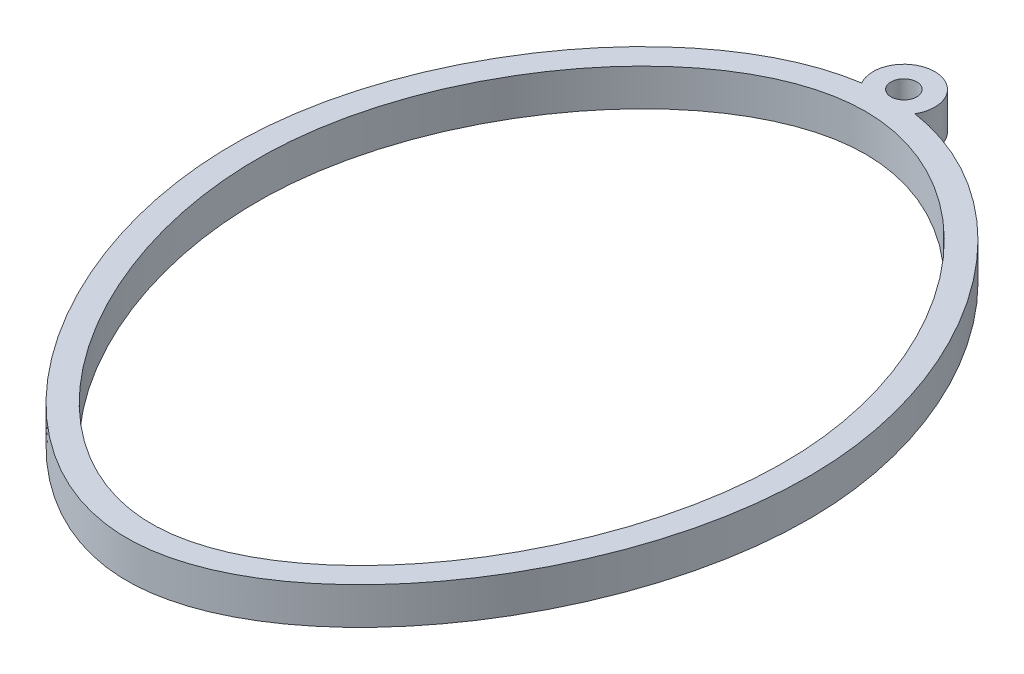
ISO-10303-21;
HEADER;
FILE_DESCRIPTION(('STEP AP214'),'2;1');
FILE_NAME('part.step','',(''),(''),'','','');
FILE_SCHEMA(('AUTOMOTIVE_DESIGN { 1 0 10303 214 1 1 1 1 }'));
ENDSEC;
DATA;
#1=APPLICATION_CONTEXT('core data for automotive mechanical design processes');
#2=APPLICATION_PROTOCOL_DEFINITION('international standard','automotive_design',2000,#1);
#3=PRODUCT_CONTEXT('',#1,'mechanical');
#4=PRODUCT('Part','Part','',(#3));
#5=PRODUCT_RELATED_PRODUCT_CATEGORY('part','',(#4));
#6=PRODUCT_DEFINITION_FORMATION('','',#4);
#7=PRODUCT_DEFINITION_CONTEXT('part definition',#1,'design');
#8=PRODUCT_DEFINITION('design','',#6,#7);
#9=PRODUCT_DEFINITION_SHAPE('','',#8);
#10=(LENGTH_UNIT() NAMED_UNIT(*) SI_UNIT(.MILLI.,.METRE.));
#11=(NAMED_UNIT(*) PLANE_ANGLE_UNIT() SI_UNIT($,.RADIAN.));
#12=(NAMED_UNIT(*) SI_UNIT($,.STERADIAN.) SOLID_ANGLE_UNIT());
#13=UNCERTAINTY_MEASURE_WITH_UNIT(LENGTH_MEASURE(1.E-05),#10,'distance_accuracy_value','');
#14=(GEOMETRIC_REPRESENTATION_CONTEXT(3) GLOBAL_UNCERTAINTY_ASSIGNED_CONTEXT((#13)) GLOBAL_UNIT_ASSIGNED_CONTEXT((#10,
#11,#12)) REPRESENTATION_CONTEXT('',''));
#15=CARTESIAN_POINT('',(0.,0.,0.));
#16=DIRECTION('',(0.,0.,1.));
#17=DIRECTION('',(1.,0.,0.));
#18=AXIS2_PLACEMENT_3D('',#15,#16,#17);
#19=CARTESIAN_POINT('',(0.,3.,-29.15815));
#20=DIRECTION('',(0.,-1.,0.));
#21=DIRECTION('',(0.,0.,-1.));
#22=AXIS2_PLACEMENT_3D('',#19,#20,#21);
#23=CYLINDRICAL_SURFACE('',#22,2.50000000000001);
#24=CARTESIAN_POINT('',(0.,0.,-29.15815));
#25=DIRECTION('',(0.,1.,0.));
#26=DIRECTION('',(0.,0.,1.));
#27=AXIS2_PLACEMENT_3D('',#24,#25,#26);
#28=CIRCLE('',#27,2.50000000000001);
#29=CARTESIAN_POINT('',(2.15648974343033,0.,-27.8934160412243));
#30=VERTEX_POINT('',#29);
#31=CARTESIAN_POINT('',(-2.15648974343032,0.,-27.8934160412243));
#32=VERTEX_POINT('',#31);
#33=EDGE_CURVE('E61',#30,#32,#28,.T.);
#34=ORIENTED_EDGE('',*,*,#33,.T.);
#35=DIRECTION('',(0.,-1.,0.));
#36=VECTOR('',#35,1.);
#37=CARTESIAN_POINT('',(-2.15648974343032,3.,-27.8934160412243));
#38=LINE('',#37,#36);
#39=CARTESIAN_POINT('',(-2.15648974343032,3.,-27.8934160412243));
#40=VERTEX_POINT('',#39);
#41=EDGE_CURVE('E11',#40,#32,#38,.T.);
#42=ORIENTED_EDGE('',*,*,#41,.F.);
#43=CARTESIAN_POINT('',(0.,3.,-29.15815));
#44=DIRECTION('',(0.,1.,0.));
#45=DIRECTION('',(0.,0.,1.));
#46=AXIS2_PLACEMENT_3D('',#43,#44,#45);
#47=CIRCLE('',#46,2.50000000000001);
#48=CARTESIAN_POINT('',(2.15648974343033,3.,-27.8934160412243));
#49=VERTEX_POINT('',#48);
#50=EDGE_CURVE('E63',#49,#40,#47,.T.);
#51=ORIENTED_EDGE('',*,*,#50,.F.);
#52=DIRECTION('',(0.,-1.,0.));
#53=VECTOR('',#52,1.);
#54=CARTESIAN_POINT('',(2.15648974343033,3.,-27.8934160412243));
#55=LINE('',#54,#53);
#56=EDGE_CURVE('E45',#49,#30,#55,.T.);
#57=ORIENTED_EDGE('',*,*,#56,.T.);
#58=EDGE_LOOP('',(#34,#42,#51,#57));
#59=FACE_BOUND('',#58,.T.);
#60=ADVANCED_FACE('F36',(#59),#23,.T.);
#61=CARTESIAN_POINT('',(0.,3.,-28.05815));
#62=CARTESIAN_POINT('',(11.1984148689767,3.,-28.05815));
#63=CARTESIAN_POINT('',(35.0157614883057,3.,0.789423132721355));
#64=CARTESIAN_POINT('',(0.,3.,51.3644304721501));
#65=CARTESIAN_POINT('',(-35.0157614883057,3.,0.789423132721347));
#66=CARTESIAN_POINT('',(-11.1984148689767,3.,-28.05815));
#67=CARTESIAN_POINT('',(0.,3.,-28.05815));
#68=B_SPLINE_CURVE_WITH_KNOTS('',3,(#61,#62,#63,#64,#65,#66,#67),.UNSPECIFIED.,.T.,.F.,(4,1,1,1,
4),(0.,0.235089471719085,0.5,0.764910528280915,1.),.UNSPECIFIED.);
#69=DIRECTION('',(0.,-1.,0.));
#70=VECTOR('',#69,1.);
#71=SURFACE_OF_LINEAR_EXTRUSION('',#68,#70);
#72=CARTESIAN_POINT('',(0.,0.,-28.05815));
#73=CARTESIAN_POINT('',(11.1984148689767,0.,-28.05815));
#74=CARTESIAN_POINT('',(35.0157614883057,0.,0.789423132721355));
#75=CARTESIAN_POINT('',(0.,0.,51.3644304721501));
#76=CARTESIAN_POINT('',(-35.0157614883057,0.,0.789423132721347));
#77=CARTESIAN_POINT('',(-11.1984148689767,0.,-28.05815));
#78=CARTESIAN_POINT('',(0.,0.,-28.05815));
#79=B_SPLINE_CURVE_WITH_KNOTS('',3,(#72,#73,#74,#75,#76,#77,#78),.UNSPECIFIED.,.T.,.F.,(4,1,1,1,
4),(0.,0.235089471719085,0.5,0.764910528280915,1.),.UNSPECIFIED.);
#80=EDGE_CURVE('E69',#30,#32,#79,.T.);
#81=ORIENTED_EDGE('',*,*,#80,.F.);
#82=ORIENTED_EDGE('',*,*,#56,.F.);
#83=EDGE_CURVE('E96',#49,#40,#68,.T.);
#84=ORIENTED_EDGE('',*,*,#83,.T.);
#85=ORIENTED_EDGE('',*,*,#41,.T.);
#86=EDGE_LOOP('',(#81,#82,#84,#85));
#87=FACE_BOUND('',#86,.T.);
#88=ADVANCED_FACE('F72',(#87),#71,.T.);
#89=CARTESIAN_POINT('',(0.,3.,-29.15815));
#90=DIRECTION('',(0.,-1.,0.));
#91=DIRECTION('',(0.,0.,-1.));
#92=AXIS2_PLACEMENT_3D('',#89,#90,#91);
#93=CYLINDRICAL_SURFACE('',#92,1.05);
#94=CARTESIAN_POINT('',(0.,3.,-29.15815));
#95=DIRECTION('',(0.,1.,0.));
#96=DIRECTION('',(0.,0.,1.));
#97=AXIS2_PLACEMENT_3D('',#94,#95,#96);
#98=CIRCLE('',#97,1.05);
#99=CARTESIAN_POINT('',(0.,3.,-28.10815));
#100=VERTEX_POINT('',#99);
#101=EDGE_CURVE('E76',#100,#100,#98,.T.);
#102=ORIENTED_EDGE('',*,*,#101,.T.);
#103=EDGE_LOOP('',(#102));
#104=FACE_BOUND('',#103,.T.);
#105=CARTESIAN_POINT('',(0.,0.,-29.15815));
#106=DIRECTION('',(0.,1.,0.));
#107=DIRECTION('',(0.,0.,1.));
#108=AXIS2_PLACEMENT_3D('',#105,#106,#107);
#109=CIRCLE('',#108,1.05);
#110=CARTESIAN_POINT('',(0.,0.,-28.10815));
#111=VERTEX_POINT('',#110);
#112=EDGE_CURVE('E70',#111,#111,#109,.T.);
#113=ORIENTED_EDGE('',*,*,#112,.F.);
#114=EDGE_LOOP('',(#113));
#115=FACE_BOUND('',#114,.T.);
#116=ADVANCED_FACE('F38',(#104,#115),#93,.F.);
#117=CARTESIAN_POINT('',(0.,3.,-26.05815));
#118=CARTESIAN_POINT('',(10.2035236768543,3.,-26.05815));
#119=CARTESIAN_POINT('',(32.0245891451344,3.,0.848463171444488));
#120=CARTESIAN_POINT('',(0.,3.,48.3534652331395));
#121=CARTESIAN_POINT('',(-32.0245891451344,3.,0.848463171444475));
#122=CARTESIAN_POINT('',(-10.2035236768543,3.,-26.05815));
#123=CARTESIAN_POINT('',(0.,3.,-26.05815));
#124=B_SPLINE_CURVE_WITH_KNOTS('',3,(#117,#118,#119,#120,#121,#122,#123),.UNSPECIFIED.,.T.,.F.,
(4,1,1,1,4),(0.,0.23379985023386,0.5,0.76620014976614,1.),.UNSPECIFIED.);
#125=DIRECTION('',(0.,-1.,0.));
#126=VECTOR('',#125,1.);
#127=SURFACE_OF_LINEAR_EXTRUSION('',#124,#126);
#128=CARTESIAN_POINT('',(0.,3.,-26.05815));
#129=VERTEX_POINT('',#128);
#130=EDGE_CURVE('E65',#129,#129,#124,.T.);
#131=ORIENTED_EDGE('',*,*,#130,.F.);
#132=EDGE_LOOP('',(#131));
#133=FACE_BOUND('',#132,.T.);
#134=CARTESIAN_POINT('',(0.,0.,-26.05815));
#135=CARTESIAN_POINT('',(10.2035236768543,0.,-26.05815));
#136=CARTESIAN_POINT('',(32.0245891451344,0.,0.848463171444488));
#137=CARTESIAN_POINT('',(0.,0.,48.3534652331395));
#138=CARTESIAN_POINT('',(-32.0245891451344,0.,0.848463171444475));
#139=CARTESIAN_POINT('',(-10.2035236768543,0.,-26.05815));
#140=CARTESIAN_POINT('',(0.,0.,-26.05815));
#141=B_SPLINE_CURVE_WITH_KNOTS('',3,(#134,#135,#136,#137,#138,#139,#140),.UNSPECIFIED.,.T.,.F.,
(4,1,1,1,4),(0.,0.23379985023386,0.5,0.76620014976614,1.),.UNSPECIFIED.);
#142=CARTESIAN_POINT('',(0.,0.,-26.05815));
#143=VERTEX_POINT('',#142);
#144=EDGE_CURVE('E73',#143,#143,#141,.T.);
#145=ORIENTED_EDGE('',*,*,#144,.T.);
#146=EDGE_LOOP('',(#145));
#147=FACE_BOUND('',#146,.T.);
#148=ADVANCED_FACE('F105',(#133,#147),#127,.F.);
#149=CARTESIAN_POINT('',(0.,3.,0.));
#150=DIRECTION('',(0.,1.,0.));
#151=DIRECTION('',(0.,0.,1.));
#152=AXIS2_PLACEMENT_3D('',#149,#150,#151);
#153=PLANE('',#152);
#154=ORIENTED_EDGE('',*,*,#101,.F.);
#155=EDGE_LOOP('',(#154));
#156=FACE_BOUND('',#155,.T.);
#157=ORIENTED_EDGE('',*,*,#50,.T.);
#158=ORIENTED_EDGE('',*,*,#83,.F.);
#159=EDGE_LOOP('',(#157,#158));
#160=FACE_BOUND('',#159,.T.);
#161=ORIENTED_EDGE('',*,*,#130,.T.);
#162=EDGE_LOOP('',(#161));
#163=FACE_BOUND('',#162,.T.);
#164=ADVANCED_FACE('F109',(#156,#160,#163),#153,.T.);
#165=CARTESIAN_POINT('',(0.,0.,0.));
#166=DIRECTION('',(0.,1.,0.));
#167=DIRECTION('',(0.,0.,1.));
#168=AXIS2_PLACEMENT_3D('',#165,#166,#167);
#169=PLANE('',#168);
#170=ORIENTED_EDGE('',*,*,#112,.T.);
#171=EDGE_LOOP('',(#170));
#172=FACE_BOUND('',#171,.T.);
#173=ORIENTED_EDGE('',*,*,#33,.F.);
#174=ORIENTED_EDGE('',*,*,#80,.T.);
#175=EDGE_LOOP('',(#173,#174));
#176=FACE_BOUND('',#175,.T.);
#177=ORIENTED_EDGE('',*,*,#144,.F.);
#178=EDGE_LOOP('',(#177));
#179=FACE_BOUND('',#178,.T.);
#180=ADVANCED_FACE('F67',(#172,#176,#179),#169,.F.);
#181=CLOSED_SHELL('',(#60,#88,#116,#148,#164,#180));
#182=MANIFOLD_SOLID_BREP('B2',#181);
#183=ADVANCED_BREP_SHAPE_REPRESENTATION('',(#18,#182),#14);
#184=SHAPE_DEFINITION_REPRESENTATION(#9,#183);
ENDSEC;
END-ISO-10303-21;
